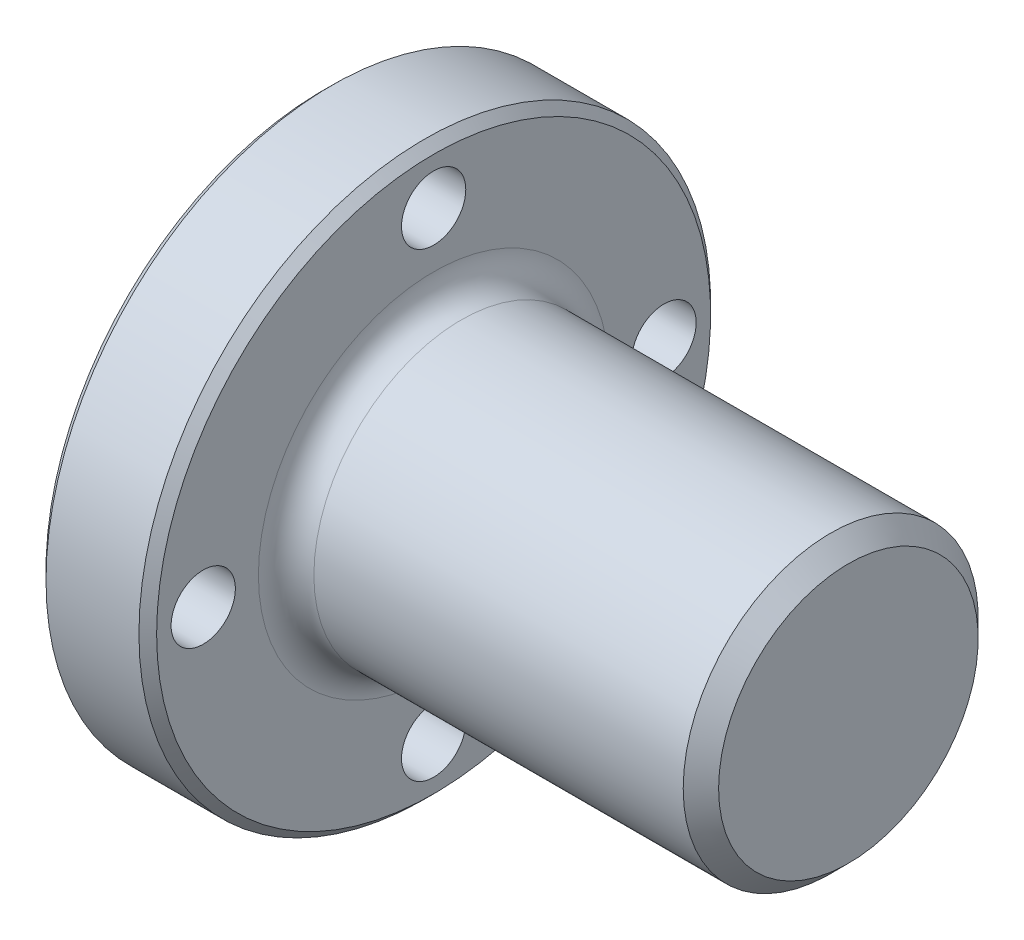
ISO-10303-21;
HEADER;
FILE_DESCRIPTION(('STEP AP214'),'2;1');
FILE_NAME('part.step','',(''),(''),'','','');
FILE_SCHEMA(('AUTOMOTIVE_DESIGN { 1 0 10303 214 1 1 1 1 }'));
ENDSEC;
DATA;
#1=APPLICATION_CONTEXT('core data for automotive mechanical design processes');
#2=APPLICATION_PROTOCOL_DEFINITION('international standard','automotive_design',2000,#1);
#3=PRODUCT_CONTEXT('',#1,'mechanical');
#4=PRODUCT('Part','Part','',(#3));
#5=PRODUCT_RELATED_PRODUCT_CATEGORY('part','',(#4));
#6=PRODUCT_DEFINITION_FORMATION('','',#4);
#7=PRODUCT_DEFINITION_CONTEXT('part definition',#1,'design');
#8=PRODUCT_DEFINITION('design','',#6,#7);
#9=PRODUCT_DEFINITION_SHAPE('','',#8);
#10=(LENGTH_UNIT() NAMED_UNIT(*) SI_UNIT(.MILLI.,.METRE.));
#11=(NAMED_UNIT(*) PLANE_ANGLE_UNIT() SI_UNIT($,.RADIAN.));
#12=(NAMED_UNIT(*) SI_UNIT($,.STERADIAN.) SOLID_ANGLE_UNIT());
#13=UNCERTAINTY_MEASURE_WITH_UNIT(LENGTH_MEASURE(1.E-05),#10,'distance_accuracy_value','');
#14=(GEOMETRIC_REPRESENTATION_CONTEXT(3) GLOBAL_UNCERTAINTY_ASSIGNED_CONTEXT((#13)) GLOBAL_UNIT_ASSIGNED_CONTEXT((#10,
#11,#12)) REPRESENTATION_CONTEXT('',''));
#15=CARTESIAN_POINT('',(0.,0.,0.));
#16=DIRECTION('',(0.,0.,1.));
#17=DIRECTION('',(1.,0.,0.));
#18=AXIS2_PLACEMENT_3D('',#15,#16,#17);
#19=CARTESIAN_POINT('',(-25.0317,0.,0.));
#20=DIRECTION('',(1.,0.,0.));
#21=DIRECTION('',(0.,0.,-1.));
#22=AXIS2_PLACEMENT_3D('',#19,#20,#21);
#23=PLANE('',#22);
#24=CARTESIAN_POINT('',(-25.0317,0.,0.));
#25=DIRECTION('',(1.,0.,0.));
#26=DIRECTION('',(0.,0.,-1.));
#27=AXIS2_PLACEMENT_3D('',#24,#25,#26);
#28=CIRCLE('',#27,7.95020000000003);
#29=CARTESIAN_POINT('',(-25.0317,0.,-7.95020000000003));
#30=VERTEX_POINT('',#29);
#31=EDGE_CURVE('E59',#30,#30,#28,.F.);
#32=ORIENTED_EDGE('',*,*,#31,.T.);
#33=EDGE_LOOP('',(#32));
#34=FACE_BOUND('',#33,.T.);
#35=ADVANCED_FACE('F43',(#34),#23,.F.);
#36=CARTESIAN_POINT('',(-50.4317,0.,0.));
#37=DIRECTION('',(-1.,0.,0.));
#38=DIRECTION('',(0.,0.,1.));
#39=AXIS2_PLACEMENT_3D('',#36,#37,#38);
#40=CYLINDRICAL_SURFACE('',#39,8.7122);
#41=CARTESIAN_POINT('',(-24.2697,0.,0.));
#42=DIRECTION('',(1.,0.,0.));
#43=DIRECTION('',(0.,0.,-1.));
#44=AXIS2_PLACEMENT_3D('',#41,#42,#43);
#45=CIRCLE('',#44,8.7122);
#46=CARTESIAN_POINT('',(-24.2697,0.,-8.7122));
#47=VERTEX_POINT('',#46);
#48=EDGE_CURVE('E55',#47,#47,#45,.T.);
#49=ORIENTED_EDGE('',*,*,#48,.T.);
#50=EDGE_LOOP('',(#49));
#51=FACE_BOUND('',#50,.T.);
#52=CARTESIAN_POINT('',(-20.2057,0.,0.));
#53=DIRECTION('',(-1.,0.,0.));
#54=DIRECTION('',(0.,0.,1.));
#55=AXIS2_PLACEMENT_3D('',#52,#53,#54);
#56=CIRCLE('',#55,8.7122);
#57=CARTESIAN_POINT('',(-20.2057,0.,8.7122));
#58=VERTEX_POINT('',#57);
#59=EDGE_CURVE('E82',#58,#58,#56,.T.);
#60=ORIENTED_EDGE('',*,*,#59,.T.);
#61=EDGE_LOOP('',(#60));
#62=FACE_BOUND('',#61,.T.);
#63=ADVANCED_FACE('F146',(#51,#62),#40,.T.);
#64=CARTESIAN_POINT('',(-20.2057,0.,-8.7122));
#65=DIRECTION('',(1.,0.,0.));
#66=DIRECTION('',(0.,0.,-1.));
#67=AXIS2_PLACEMENT_3D('',#64,#65,#66);
#68=PLANE('',#67);
#69=CARTESIAN_POINT('',(-20.2057,0.,-19.8374));
#70=DIRECTION('',(1.,0.,0.));
#71=DIRECTION('',(0.,0.,-1.));
#72=AXIS2_PLACEMENT_3D('',#69,#70,#71);
#73=CIRCLE('',#72,2.7686);
#74=CARTESIAN_POINT('',(-20.2057,0.,-22.606));
#75=VERTEX_POINT('',#74);
#76=EDGE_CURVE('E85',#75,#75,#73,.F.);
#77=ORIENTED_EDGE('',*,*,#76,.F.);
#78=EDGE_LOOP('',(#77));
#79=FACE_BOUND('',#78,.T.);
#80=CARTESIAN_POINT('',(-20.2057,19.8374,0.));
#81=DIRECTION('',(1.,0.,0.));
#82=DIRECTION('',(0.,0.,-1.));
#83=AXIS2_PLACEMENT_3D('',#80,#81,#82);
#84=CIRCLE('',#83,2.7686);
#85=CARTESIAN_POINT('',(-20.2057,19.8374,-2.7686));
#86=VERTEX_POINT('',#85);
#87=EDGE_CURVE('E96',#86,#86,#84,.F.);
#88=ORIENTED_EDGE('',*,*,#87,.F.);
#89=EDGE_LOOP('',(#88));
#90=FACE_BOUND('',#89,.T.);
#91=CARTESIAN_POINT('',(-20.2057,0.,19.8374));
#92=DIRECTION('',(1.,0.,0.));
#93=DIRECTION('',(0.,0.,-1.));
#94=AXIS2_PLACEMENT_3D('',#91,#92,#93);
#95=CIRCLE('',#94,2.7686);
#96=CARTESIAN_POINT('',(-20.2057,0.,17.0688));
#97=VERTEX_POINT('',#96);
#98=EDGE_CURVE('E89',#97,#97,#95,.F.);
#99=ORIENTED_EDGE('',*,*,#98,.F.);
#100=EDGE_LOOP('',(#99));
#101=FACE_BOUND('',#100,.T.);
#102=CARTESIAN_POINT('',(-20.2057,-19.8374,0.));
#103=DIRECTION('',(1.,0.,0.));
#104=DIRECTION('',(0.,0.,-1.));
#105=AXIS2_PLACEMENT_3D('',#102,#103,#104);
#106=CIRCLE('',#105,2.7686);
#107=CARTESIAN_POINT('',(-20.2057,-19.8374,-2.7686));
#108=VERTEX_POINT('',#107);
#109=EDGE_CURVE('E90',#108,#108,#106,.F.);
#110=ORIENTED_EDGE('',*,*,#109,.F.);
#111=EDGE_LOOP('',(#110));
#112=FACE_BOUND('',#111,.T.);
#113=CARTESIAN_POINT('',(-20.2057,0.,0.));
#114=DIRECTION('',(1.,0.,0.));
#115=DIRECTION('',(0.,0.,-1.));
#116=AXIS2_PLACEMENT_3D('',#113,#114,#115);
#117=CIRCLE('',#116,23.8506);
#118=CARTESIAN_POINT('',(-20.2057,0.,-23.8506));
#119=VERTEX_POINT('',#118);
#120=EDGE_CURVE('E64',#119,#119,#117,.F.);
#121=ORIENTED_EDGE('',*,*,#120,.T.);
#122=EDGE_LOOP('',(#121));
#123=FACE_BOUND('',#122,.T.);
#124=ORIENTED_EDGE('',*,*,#59,.F.);
#125=EDGE_LOOP('',(#124));
#126=FACE_BOUND('',#125,.T.);
#127=ADVANCED_FACE('F151',(#79,#90,#101,#112,#123,#126),#68,.F.);
#128=CARTESIAN_POINT('',(-50.4317,0.,0.));
#129=DIRECTION('',(-1.,0.,0.));
#130=DIRECTION('',(0.,0.,1.));
#131=AXIS2_PLACEMENT_3D('',#128,#129,#130);
#132=CYLINDRICAL_SURFACE('',#131,24.6126);
#133=CARTESIAN_POINT('',(-11.4427,0.,0.));
#134=DIRECTION('',(-1.,0.,0.));
#135=DIRECTION('',(0.,0.,1.));
#136=AXIS2_PLACEMENT_3D('',#133,#134,#135);
#137=CIRCLE('',#136,24.6126);
#138=CARTESIAN_POINT('',(-11.4427,0.,24.6126));
#139=VERTEX_POINT('',#138);
#140=EDGE_CURVE('E70',#139,#139,#137,.T.);
#141=ORIENTED_EDGE('',*,*,#140,.T.);
#142=EDGE_LOOP('',(#141));
#143=FACE_BOUND('',#142,.T.);
#144=CARTESIAN_POINT('',(-19.4437,0.,0.));
#145=DIRECTION('',(1.,0.,0.));
#146=DIRECTION('',(0.,0.,-1.));
#147=AXIS2_PLACEMENT_3D('',#144,#145,#146);
#148=CIRCLE('',#147,24.6126);
#149=CARTESIAN_POINT('',(-19.4437,0.,-24.6126));
#150=VERTEX_POINT('',#149);
#151=EDGE_CURVE('E73',#150,#150,#148,.T.);
#152=ORIENTED_EDGE('',*,*,#151,.T.);
#153=EDGE_LOOP('',(#152));
#154=FACE_BOUND('',#153,.T.);
#155=ADVANCED_FACE('F117',(#143,#154),#132,.T.);
#156=CARTESIAN_POINT('',(-10.6807,0.,-24.6126));
#157=DIRECTION('',(-1.,0.,0.));
#158=DIRECTION('',(0.,0.,1.));
#159=AXIS2_PLACEMENT_3D('',#156,#157,#158);
#160=PLANE('',#159);
#161=CARTESIAN_POINT('',(-10.6807,0.,-19.8374));
#162=DIRECTION('',(1.,0.,0.));
#163=DIRECTION('',(0.,0.,-1.));
#164=AXIS2_PLACEMENT_3D('',#161,#162,#163);
#165=CIRCLE('',#164,2.7686);
#166=CARTESIAN_POINT('',(-10.6807,0.,-22.606));
#167=VERTEX_POINT('',#166);
#168=EDGE_CURVE('E102',#167,#167,#165,.T.);
#169=ORIENTED_EDGE('',*,*,#168,.F.);
#170=EDGE_LOOP('',(#169));
#171=FACE_BOUND('',#170,.T.);
#172=CARTESIAN_POINT('',(-10.6807,19.8374,0.));
#173=DIRECTION('',(1.,0.,0.));
#174=DIRECTION('',(0.,0.,-1.));
#175=AXIS2_PLACEMENT_3D('',#172,#173,#174);
#176=CIRCLE('',#175,2.7686);
#177=CARTESIAN_POINT('',(-10.6807,19.8374,-2.7686));
#178=VERTEX_POINT('',#177);
#179=EDGE_CURVE('E99',#178,#178,#176,.T.);
#180=ORIENTED_EDGE('',*,*,#179,.F.);
#181=EDGE_LOOP('',(#180));
#182=FACE_BOUND('',#181,.T.);
#183=CARTESIAN_POINT('',(-10.6807,0.,19.8374));
#184=DIRECTION('',(1.,0.,0.));
#185=DIRECTION('',(0.,0.,-1.));
#186=AXIS2_PLACEMENT_3D('',#183,#184,#185);
#187=CIRCLE('',#186,2.7686);
#188=CARTESIAN_POINT('',(-10.6807,0.,17.0688));
#189=VERTEX_POINT('',#188);
#190=EDGE_CURVE('E93',#189,#189,#187,.T.);
#191=ORIENTED_EDGE('',*,*,#190,.F.);
#192=EDGE_LOOP('',(#191));
#193=FACE_BOUND('',#192,.T.);
#194=CARTESIAN_POINT('',(-10.6807,-19.8374,0.));
#195=DIRECTION('',(1.,0.,0.));
#196=DIRECTION('',(0.,0.,-1.));
#197=AXIS2_PLACEMENT_3D('',#194,#195,#196);
#198=CIRCLE('',#197,2.7686);
#199=CARTESIAN_POINT('',(-10.6807,-19.8374,-2.7686));
#200=VERTEX_POINT('',#199);
#201=EDGE_CURVE('E86',#200,#200,#198,.T.);
#202=ORIENTED_EDGE('',*,*,#201,.F.);
#203=EDGE_LOOP('',(#202));
#204=FACE_BOUND('',#203,.T.);
#205=CARTESIAN_POINT('',(-10.6807,0.,0.));
#206=DIRECTION('',(-1.,0.,0.));
#207=DIRECTION('',(0.,0.,1.));
#208=AXIS2_PLACEMENT_3D('',#205,#206,#207);
#209=CIRCLE('',#208,23.8506);
#210=CARTESIAN_POINT('',(-10.6807,0.,23.8506));
#211=VERTEX_POINT('',#210);
#212=EDGE_CURVE('E67',#211,#211,#209,.F.);
#213=ORIENTED_EDGE('',*,*,#212,.T.);
#214=EDGE_LOOP('',(#213));
#215=FACE_BOUND('',#214,.T.);
#216=CARTESIAN_POINT('',(-10.6807,0.,0.));
#217=DIRECTION('',(-1.,0.,0.));
#218=DIRECTION('',(0.,0.,1.));
#219=AXIS2_PLACEMENT_3D('',#216,#217,#218);
#220=CIRCLE('',#219,15.0876);
#221=CARTESIAN_POINT('',(-10.6807,0.,15.0876));
#222=VERTEX_POINT('',#221);
#223=EDGE_CURVE('E79',#222,#222,#220,.T.);
#224=ORIENTED_EDGE('',*,*,#223,.T.);
#225=EDGE_LOOP('',(#224));
#226=FACE_BOUND('',#225,.T.);
#227=ADVANCED_FACE('F113',(#171,#182,#193,#204,#215,#226),#160,.F.);
#228=CARTESIAN_POINT('',(-50.4317,0.,0.));
#229=DIRECTION('',(-1.,0.,0.));
#230=DIRECTION('',(0.,0.,1.));
#231=AXIS2_PLACEMENT_3D('',#228,#229,#230);
#232=CYLINDRICAL_SURFACE('',#231,12.7);
#233=CARTESIAN_POINT('',(23.5077,0.,0.));
#234=DIRECTION('',(-1.,0.,0.));
#235=DIRECTION('',(0.,0.,1.));
#236=AXIS2_PLACEMENT_3D('',#233,#234,#235);
#237=CIRCLE('',#236,12.7);
#238=CARTESIAN_POINT('',(23.5077,0.,12.7));
#239=VERTEX_POINT('',#238);
#240=EDGE_CURVE('E51',#239,#239,#237,.T.);
#241=ORIENTED_EDGE('',*,*,#240,.T.);
#242=EDGE_LOOP('',(#241));
#243=FACE_BOUND('',#242,.T.);
#244=CARTESIAN_POINT('',(-8.2931,0.,0.));
#245=DIRECTION('',(-1.,0.,0.));
#246=DIRECTION('',(0.,0.,1.));
#247=AXIS2_PLACEMENT_3D('',#244,#245,#246);
#248=CIRCLE('',#247,12.7);
#249=CARTESIAN_POINT('',(-8.2931,0.,12.7));
#250=VERTEX_POINT('',#249);
#251=EDGE_CURVE('E76',#250,#250,#248,.F.);
#252=ORIENTED_EDGE('',*,*,#251,.T.);
#253=EDGE_LOOP('',(#252));
#254=FACE_BOUND('',#253,.T.);
#255=ADVANCED_FACE('F116',(#243,#254),#232,.T.);
#256=CARTESIAN_POINT('',(25.0317,0.,-12.7));
#257=DIRECTION('',(-1.,0.,0.));
#258=DIRECTION('',(0.,0.,1.));
#259=AXIS2_PLACEMENT_3D('',#256,#257,#258);
#260=PLANE('',#259);
#261=CARTESIAN_POINT('',(25.0317,0.,0.));
#262=DIRECTION('',(-1.,0.,0.));
#263=DIRECTION('',(0.,0.,1.));
#264=AXIS2_PLACEMENT_3D('',#261,#262,#263);
#265=CIRCLE('',#264,11.176);
#266=CARTESIAN_POINT('',(25.0317,0.,11.176));
#267=VERTEX_POINT('',#266);
#268=EDGE_CURVE('E10',#267,#267,#265,.F.);
#269=ORIENTED_EDGE('',*,*,#268,.T.);
#270=EDGE_LOOP('',(#269));
#271=FACE_BOUND('',#270,.T.);
#272=ADVANCED_FACE('F132',(#271),#260,.F.);
#273=CARTESIAN_POINT('',(-8.2931,0.,0.));
#274=DIRECTION('',(-1.,0.,0.));
#275=DIRECTION('',(0.,0.,1.));
#276=AXIS2_PLACEMENT_3D('',#273,#274,#275);
#277=TOROIDAL_SURFACE('',#276,15.0876,2.3876);
#278=ORIENTED_EDGE('',*,*,#251,.F.);
#279=EDGE_LOOP('',(#278));
#280=FACE_BOUND('',#279,.T.);
#281=ORIENTED_EDGE('',*,*,#223,.F.);
#282=EDGE_LOOP('',(#281));
#283=FACE_BOUND('',#282,.T.);
#284=ADVANCED_FACE('F129',(#280,#283),#277,.F.);
#285=CARTESIAN_POINT('',(-11.4427,0.,0.));
#286=DIRECTION('',(-1.,0.,0.));
#287=DIRECTION('',(0.,0.,1.));
#288=AXIS2_PLACEMENT_3D('',#285,#286,#287);
#289=CONICAL_SURFACE('',#288,24.6126,0.785398163397457);
#290=ORIENTED_EDGE('',*,*,#212,.F.);
#291=EDGE_LOOP('',(#290));
#292=FACE_BOUND('',#291,.T.);
#293=ORIENTED_EDGE('',*,*,#140,.F.);
#294=EDGE_LOOP('',(#293));
#295=FACE_BOUND('',#294,.T.);
#296=ADVANCED_FACE('F131',(#292,#295),#289,.T.);
#297=CARTESIAN_POINT('',(-20.2057,0.,0.));
#298=DIRECTION('',(1.,0.,0.));
#299=DIRECTION('',(0.,0.,-1.));
#300=AXIS2_PLACEMENT_3D('',#297,#298,#299);
#301=CONICAL_SURFACE('',#300,23.8506,0.785398163397432);
#302=ORIENTED_EDGE('',*,*,#151,.F.);
#303=EDGE_LOOP('',(#302));
#304=FACE_BOUND('',#303,.T.);
#305=ORIENTED_EDGE('',*,*,#120,.F.);
#306=EDGE_LOOP('',(#305));
#307=FACE_BOUND('',#306,.T.);
#308=ADVANCED_FACE('F139',(#304,#307),#301,.T.);
#309=CARTESIAN_POINT('',(-25.0317,0.,0.));
#310=DIRECTION('',(1.,0.,0.));
#311=DIRECTION('',(0.,0.,-1.));
#312=AXIS2_PLACEMENT_3D('',#309,#310,#311);
#313=CONICAL_SURFACE('',#312,7.95020000000003,0.785398163397446);
#314=ORIENTED_EDGE('',*,*,#48,.F.);
#315=EDGE_LOOP('',(#314));
#316=FACE_BOUND('',#315,.T.);
#317=ORIENTED_EDGE('',*,*,#31,.F.);
#318=EDGE_LOOP('',(#317));
#319=FACE_BOUND('',#318,.T.);
#320=ADVANCED_FACE('F212',(#316,#319),#313,.T.);
#321=CARTESIAN_POINT('',(23.5077,0.,0.));
#322=DIRECTION('',(-1.,0.,0.));
#323=DIRECTION('',(0.,0.,1.));
#324=AXIS2_PLACEMENT_3D('',#321,#322,#323);
#325=CONICAL_SURFACE('',#324,12.7,0.785398163397454);
#326=ORIENTED_EDGE('',*,*,#268,.F.);
#327=EDGE_LOOP('',(#326));
#328=FACE_BOUND('',#327,.T.);
#329=ORIENTED_EDGE('',*,*,#240,.F.);
#330=EDGE_LOOP('',(#329));
#331=FACE_BOUND('',#330,.T.);
#332=ADVANCED_FACE('F46',(#328,#331),#325,.T.);
#333=CARTESIAN_POINT('',(-25.0317,-19.8374,0.));
#334=DIRECTION('',(1.,0.,0.));
#335=DIRECTION('',(0.,0.,-1.));
#336=AXIS2_PLACEMENT_3D('',#333,#334,#335);
#337=CYLINDRICAL_SURFACE('',#336,2.7686);
#338=ORIENTED_EDGE('',*,*,#201,.T.);
#339=EDGE_LOOP('',(#338));
#340=FACE_BOUND('',#339,.T.);
#341=ORIENTED_EDGE('',*,*,#109,.T.);
#342=EDGE_LOOP('',(#341));
#343=FACE_BOUND('',#342,.T.);
#344=ADVANCED_FACE('F163',(#340,#343),#337,.F.);
#345=CARTESIAN_POINT('',(-25.0317,0.,19.8374));
#346=DIRECTION('',(1.,0.,0.));
#347=DIRECTION('',(0.,0.,-1.));
#348=AXIS2_PLACEMENT_3D('',#345,#346,#347);
#349=CYLINDRICAL_SURFACE('',#348,2.7686);
#350=ORIENTED_EDGE('',*,*,#190,.T.);
#351=EDGE_LOOP('',(#350));
#352=FACE_BOUND('',#351,.T.);
#353=ORIENTED_EDGE('',*,*,#98,.T.);
#354=EDGE_LOOP('',(#353));
#355=FACE_BOUND('',#354,.T.);
#356=ADVANCED_FACE('F166',(#352,#355),#349,.F.);
#357=CARTESIAN_POINT('',(-25.0317,19.8374,0.));
#358=DIRECTION('',(1.,0.,0.));
#359=DIRECTION('',(0.,0.,-1.));
#360=AXIS2_PLACEMENT_3D('',#357,#358,#359);
#361=CYLINDRICAL_SURFACE('',#360,2.7686);
#362=ORIENTED_EDGE('',*,*,#179,.T.);
#363=EDGE_LOOP('',(#362));
#364=FACE_BOUND('',#363,.T.);
#365=ORIENTED_EDGE('',*,*,#87,.T.);
#366=EDGE_LOOP('',(#365));
#367=FACE_BOUND('',#366,.T.);
#368=ADVANCED_FACE('F170',(#364,#367),#361,.F.);
#369=CARTESIAN_POINT('',(-25.0317,0.,-19.8374));
#370=DIRECTION('',(1.,0.,0.));
#371=DIRECTION('',(0.,0.,-1.));
#372=AXIS2_PLACEMENT_3D('',#369,#370,#371);
#373=CYLINDRICAL_SURFACE('',#372,2.7686);
#374=ORIENTED_EDGE('',*,*,#168,.T.);
#375=EDGE_LOOP('',(#374));
#376=FACE_BOUND('',#375,.T.);
#377=ORIENTED_EDGE('',*,*,#76,.T.);
#378=EDGE_LOOP('',(#377));
#379=FACE_BOUND('',#378,.T.);
#380=ADVANCED_FACE('F110',(#376,#379),#373,.F.);
#381=CLOSED_SHELL('',(#35,#63,#127,#155,#227,#255,#272,#284,#296,#308,#320,#332,#344,#356,#368,#380));
#382=MANIFOLD_SOLID_BREP('B2',#381);
#383=ADVANCED_BREP_SHAPE_REPRESENTATION('',(#18,#382),#14);
#384=SHAPE_DEFINITION_REPRESENTATION(#9,#383);
ENDSEC;
END-ISO-10303-21;
